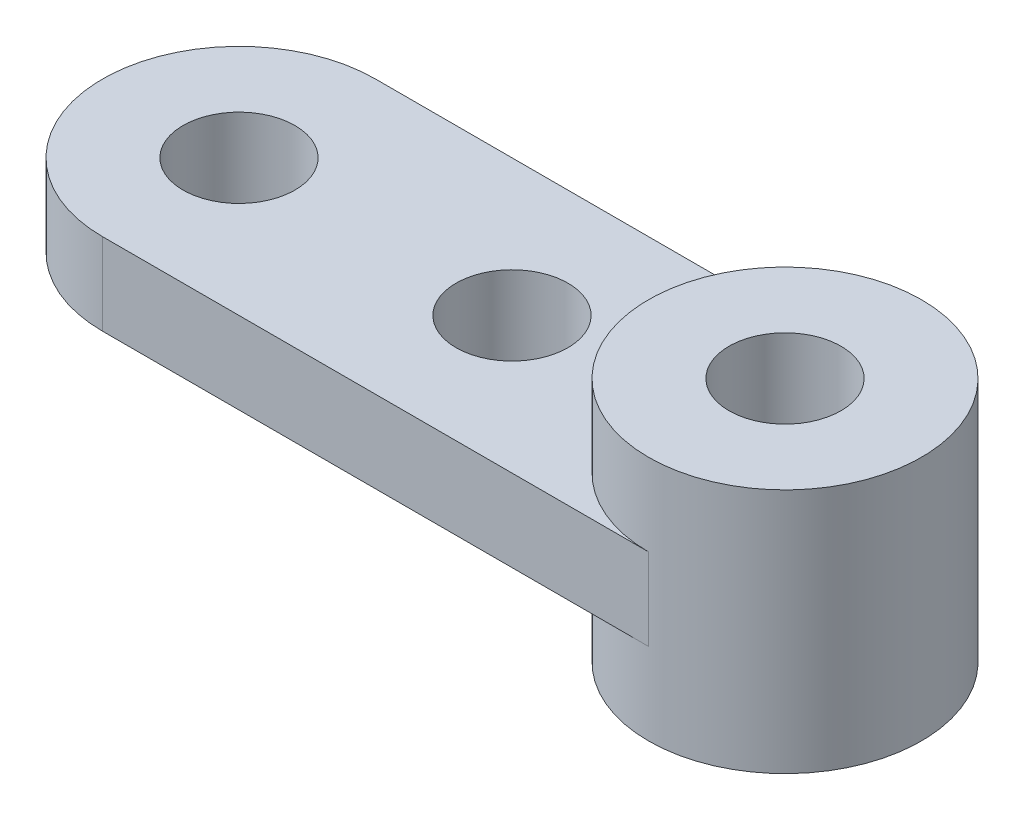
ISO-10303-21;
HEADER;
FILE_DESCRIPTION(('STEP AP214'),'2;1');
FILE_NAME('part.step','',(''),(''),'','','');
FILE_SCHEMA(('AUTOMOTIVE_DESIGN { 1 0 10303 214 1 1 1 1 }'));
ENDSEC;
DATA;
#1=APPLICATION_CONTEXT('core data for automotive mechanical design processes');
#2=APPLICATION_PROTOCOL_DEFINITION('international standard','automotive_design',2000,#1);
#3=PRODUCT_CONTEXT('',#1,'mechanical');
#4=PRODUCT('Part','Part','',(#3));
#5=PRODUCT_RELATED_PRODUCT_CATEGORY('part','',(#4));
#6=PRODUCT_DEFINITION_FORMATION('','',#4);
#7=PRODUCT_DEFINITION_CONTEXT('part definition',#1,'design');
#8=PRODUCT_DEFINITION('design','',#6,#7);
#9=PRODUCT_DEFINITION_SHAPE('','',#8);
#10=(LENGTH_UNIT() NAMED_UNIT(*) SI_UNIT(.MILLI.,.METRE.));
#11=(NAMED_UNIT(*) PLANE_ANGLE_UNIT() SI_UNIT($,.RADIAN.));
#12=(NAMED_UNIT(*) SI_UNIT($,.STERADIAN.) SOLID_ANGLE_UNIT());
#13=UNCERTAINTY_MEASURE_WITH_UNIT(LENGTH_MEASURE(1.E-05),#10,'distance_accuracy_value','');
#14=(GEOMETRIC_REPRESENTATION_CONTEXT(3) GLOBAL_UNCERTAINTY_ASSIGNED_CONTEXT((#13)) GLOBAL_UNIT_ASSIGNED_CONTEXT((#10,
#11,#12)) REPRESENTATION_CONTEXT('',''));
#15=CARTESIAN_POINT('',(0.,0.,0.));
#16=DIRECTION('',(0.,0.,1.));
#17=DIRECTION('',(1.,0.,0.));
#18=AXIS2_PLACEMENT_3D('',#15,#16,#17);
#19=CARTESIAN_POINT('',(-10.,1.5,5.));
#20=DIRECTION('',(0.,1.,0.));
#21=DIRECTION('',(0.,0.,1.));
#22=AXIS2_PLACEMENT_3D('',#19,#20,#21);
#23=PLANE('',#22);
#24=CARTESIAN_POINT('',(10.,1.5,5.));
#25=DIRECTION('',(0.,1.,0.));
#26=DIRECTION('',(0.,0.,1.));
#27=AXIS2_PLACEMENT_3D('',#24,#25,#26);
#28=CIRCLE('',#27,5.);
#29=CARTESIAN_POINT('',(10.,1.5,0.));
#30=VERTEX_POINT('',#29);
#31=CARTESIAN_POINT('',(10.,1.5,10.));
#32=VERTEX_POINT('',#31);
#33=EDGE_CURVE('E54',#30,#32,#28,.T.);
#34=ORIENTED_EDGE('',*,*,#33,.F.);
#35=DIRECTION('',(-1.,0.,0.));
#36=VECTOR('',#35,1.);
#37=CARTESIAN_POINT('',(5.,1.5,0.));
#38=LINE('',#37,#36);
#39=CARTESIAN_POINT('',(-10.,1.5,0.));
#40=VERTEX_POINT('',#39);
#41=EDGE_CURVE('E63',#30,#40,#38,.T.);
#42=ORIENTED_EDGE('',*,*,#41,.T.);
#43=CARTESIAN_POINT('',(-10.,1.5,5.));
#44=DIRECTION('',(0.,1.,0.));
#45=DIRECTION('',(0.,0.,1.));
#46=AXIS2_PLACEMENT_3D('',#43,#44,#45);
#47=CIRCLE('',#46,5.);
#48=CARTESIAN_POINT('',(-10.,1.5,10.));
#49=VERTEX_POINT('',#48);
#50=EDGE_CURVE('E105',#40,#49,#47,.T.);
#51=ORIENTED_EDGE('',*,*,#50,.T.);
#52=DIRECTION('',(1.,0.,0.));
#53=VECTOR('',#52,1.);
#54=CARTESIAN_POINT('',(-10.,1.5,10.));
#55=LINE('',#54,#53);
#56=EDGE_CURVE('E87',#49,#32,#55,.T.);
#57=ORIENTED_EDGE('',*,*,#56,.T.);
#58=EDGE_LOOP('',(#34,#42,#51,#57));
#59=FACE_BOUND('',#58,.T.);
#60=CARTESIAN_POINT('',(-10.,1.5,5.));
#61=DIRECTION('',(0.,1.,0.));
#62=DIRECTION('',(0.,0.,-1.));
#63=AXIS2_PLACEMENT_3D('',#60,#61,#62);
#64=CIRCLE('',#63,2.05);
#65=CARTESIAN_POINT('',(-10.,1.5,2.95));
#66=VERTEX_POINT('',#65);
#67=EDGE_CURVE('E120',#66,#66,#64,.T.);
#68=ORIENTED_EDGE('',*,*,#67,.F.);
#69=EDGE_LOOP('',(#68));
#70=FACE_BOUND('',#69,.T.);
#71=CARTESIAN_POINT('',(0.,1.5,5.));
#72=DIRECTION('',(0.,1.,0.));
#73=DIRECTION('',(0.,0.,1.));
#74=AXIS2_PLACEMENT_3D('',#71,#72,#73);
#75=CIRCLE('',#74,2.05);
#76=CARTESIAN_POINT('',(0.,1.5,7.05));
#77=VERTEX_POINT('',#76);
#78=EDGE_CURVE('E131',#77,#77,#75,.T.);
#79=ORIENTED_EDGE('',*,*,#78,.F.);
#80=EDGE_LOOP('',(#79));
#81=FACE_BOUND('',#80,.T.);
#82=ADVANCED_FACE('F43',(#59,#70,#81),#23,.T.);
#83=CARTESIAN_POINT('',(-10.,-1.5,5.));
#84=DIRECTION('',(0.,1.,0.));
#85=DIRECTION('',(0.,0.,1.));
#86=AXIS2_PLACEMENT_3D('',#83,#84,#85);
#87=PLANE('',#86);
#88=DIRECTION('',(-1.,0.,0.));
#89=VECTOR('',#88,1.);
#90=CARTESIAN_POINT('',(-10.,-1.5,0.));
#91=LINE('',#90,#89);
#92=CARTESIAN_POINT('',(10.,-1.5,0.));
#93=VERTEX_POINT('',#92);
#94=CARTESIAN_POINT('',(-10.,-1.5,0.));
#95=VERTEX_POINT('',#94);
#96=EDGE_CURVE('E80',#93,#95,#91,.T.);
#97=ORIENTED_EDGE('',*,*,#96,.F.);
#98=CARTESIAN_POINT('',(10.,-1.5,5.));
#99=DIRECTION('',(0.,1.,0.));
#100=DIRECTION('',(0.,0.,1.));
#101=AXIS2_PLACEMENT_3D('',#98,#99,#100);
#102=CIRCLE('',#101,5.);
#103=CARTESIAN_POINT('',(10.,-1.5,10.));
#104=VERTEX_POINT('',#103);
#105=EDGE_CURVE('E11',#93,#104,#102,.T.);
#106=ORIENTED_EDGE('',*,*,#105,.T.);
#107=DIRECTION('',(1.,0.,0.));
#108=VECTOR('',#107,1.);
#109=CARTESIAN_POINT('',(5.,-1.5,10.));
#110=LINE('',#109,#108);
#111=CARTESIAN_POINT('',(-10.,-1.5,10.));
#112=VERTEX_POINT('',#111);
#113=EDGE_CURVE('E106',#112,#104,#110,.T.);
#114=ORIENTED_EDGE('',*,*,#113,.F.);
#115=CARTESIAN_POINT('',(-10.,-1.5,5.));
#116=DIRECTION('',(0.,1.,0.));
#117=DIRECTION('',(0.,0.,1.));
#118=AXIS2_PLACEMENT_3D('',#115,#116,#117);
#119=CIRCLE('',#118,5.);
#120=EDGE_CURVE('E103',#95,#112,#119,.T.);
#121=ORIENTED_EDGE('',*,*,#120,.F.);
#122=EDGE_LOOP('',(#97,#106,#114,#121));
#123=FACE_BOUND('',#122,.T.);
#124=CARTESIAN_POINT('',(-10.,-1.5,5.));
#125=DIRECTION('',(0.,1.,0.));
#126=DIRECTION('',(0.,0.,-1.));
#127=AXIS2_PLACEMENT_3D('',#124,#125,#126);
#128=CIRCLE('',#127,2.05);
#129=CARTESIAN_POINT('',(-10.,-1.5,2.95));
#130=VERTEX_POINT('',#129);
#131=EDGE_CURVE('E127',#130,#130,#128,.T.);
#132=ORIENTED_EDGE('',*,*,#131,.T.);
#133=EDGE_LOOP('',(#132));
#134=FACE_BOUND('',#133,.T.);
#135=CARTESIAN_POINT('',(0.,-1.5,5.));
#136=DIRECTION('',(0.,1.,0.));
#137=DIRECTION('',(0.,0.,1.));
#138=AXIS2_PLACEMENT_3D('',#135,#136,#137);
#139=CIRCLE('',#138,2.05);
#140=CARTESIAN_POINT('',(0.,-1.5,7.05));
#141=VERTEX_POINT('',#140);
#142=EDGE_CURVE('E135',#141,#141,#139,.T.);
#143=ORIENTED_EDGE('',*,*,#142,.T.);
#144=EDGE_LOOP('',(#143));
#145=FACE_BOUND('',#144,.T.);
#146=ADVANCED_FACE('F100',(#123,#134,#145),#87,.F.);
#147=CARTESIAN_POINT('',(-10.,1.5,5.));
#148=DIRECTION('',(0.,-1.,0.));
#149=DIRECTION('',(0.,0.,-1.));
#150=AXIS2_PLACEMENT_3D('',#147,#148,#149);
#151=CYLINDRICAL_SURFACE('',#150,5.);
#152=ORIENTED_EDGE('',*,*,#120,.T.);
#153=DIRECTION('',(0.,-1.,0.));
#154=VECTOR('',#153,1.);
#155=CARTESIAN_POINT('',(-10.,1.5,10.));
#156=LINE('',#155,#154);
#157=EDGE_CURVE('E47',#49,#112,#156,.T.);
#158=ORIENTED_EDGE('',*,*,#157,.F.);
#159=ORIENTED_EDGE('',*,*,#50,.F.);
#160=DIRECTION('',(0.,-1.,0.));
#161=VECTOR('',#160,1.);
#162=CARTESIAN_POINT('',(-10.,1.5,0.));
#163=LINE('',#162,#161);
#164=EDGE_CURVE('E110',#40,#95,#163,.T.);
#165=ORIENTED_EDGE('',*,*,#164,.T.);
#166=EDGE_LOOP('',(#152,#158,#159,#165));
#167=FACE_BOUND('',#166,.T.);
#168=ADVANCED_FACE('F45',(#167),#151,.T.);
#169=CARTESIAN_POINT('',(5.,1.5,10.));
#170=DIRECTION('',(0.,0.,-1.));
#171=DIRECTION('',(-1.,0.,0.));
#172=AXIS2_PLACEMENT_3D('',#169,#170,#171);
#173=PLANE('',#172);
#174=ORIENTED_EDGE('',*,*,#113,.T.);
#175=DIRECTION('',(0.,-1.,0.));
#176=VECTOR('',#175,1.);
#177=CARTESIAN_POINT('',(10.,1.5,10.));
#178=LINE('',#177,#176);
#179=EDGE_CURVE('E98',#32,#104,#178,.T.);
#180=ORIENTED_EDGE('',*,*,#179,.F.);
#181=ORIENTED_EDGE('',*,*,#56,.F.);
#182=ORIENTED_EDGE('',*,*,#157,.T.);
#183=EDGE_LOOP('',(#174,#180,#181,#182));
#184=FACE_BOUND('',#183,.T.);
#185=ADVANCED_FACE('F186',(#184),#173,.F.);
#186=CARTESIAN_POINT('',(10.,1.5,5.));
#187=DIRECTION('',(0.,-1.,0.));
#188=DIRECTION('',(0.,0.,-1.));
#189=AXIS2_PLACEMENT_3D('',#186,#187,#188);
#190=CYLINDRICAL_SURFACE('',#189,5.);
#191=ORIENTED_EDGE('',*,*,#179,.T.);
#192=ORIENTED_EDGE('',*,*,#105,.F.);
#193=DIRECTION('',(0.,-1.,0.));
#194=VECTOR('',#193,1.);
#195=CARTESIAN_POINT('',(10.,1.5,0.));
#196=LINE('',#195,#194);
#197=EDGE_CURVE('E97',#30,#93,#196,.T.);
#198=ORIENTED_EDGE('',*,*,#197,.F.);
#199=ORIENTED_EDGE('',*,*,#33,.T.);
#200=EDGE_LOOP('',(#191,#192,#198,#199));
#201=FACE_BOUND('',#200,.T.);
#202=CARTESIAN_POINT('',(10.,4.5,5.));
#203=DIRECTION('',(0.,1.,0.));
#204=DIRECTION('',(0.,0.,1.));
#205=AXIS2_PLACEMENT_3D('',#202,#203,#204);
#206=CIRCLE('',#205,5.);
#207=CARTESIAN_POINT('',(10.,4.5,10.));
#208=VERTEX_POINT('',#207);
#209=EDGE_CURVE('E139',#208,#208,#206,.T.);
#210=ORIENTED_EDGE('',*,*,#209,.F.);
#211=EDGE_LOOP('',(#210));
#212=FACE_BOUND('',#211,.T.);
#213=CARTESIAN_POINT('',(10.,-4.5,5.));
#214=DIRECTION('',(0.,1.,0.));
#215=DIRECTION('',(0.,0.,1.));
#216=AXIS2_PLACEMENT_3D('',#213,#214,#215);
#217=CIRCLE('',#216,5.);
#218=CARTESIAN_POINT('',(10.,-4.5,10.));
#219=VERTEX_POINT('',#218);
#220=EDGE_CURVE('E151',#219,#219,#217,.T.);
#221=ORIENTED_EDGE('',*,*,#220,.T.);
#222=EDGE_LOOP('',(#221));
#223=FACE_BOUND('',#222,.T.);
#224=ADVANCED_FACE('F94',(#201,#212,#223),#190,.T.);
#225=CARTESIAN_POINT('',(-10.,1.5,0.));
#226=DIRECTION('',(0.,0.,1.));
#227=DIRECTION('',(1.,0.,0.));
#228=AXIS2_PLACEMENT_3D('',#225,#226,#227);
#229=PLANE('',#228);
#230=ORIENTED_EDGE('',*,*,#96,.T.);
#231=ORIENTED_EDGE('',*,*,#164,.F.);
#232=ORIENTED_EDGE('',*,*,#41,.F.);
#233=ORIENTED_EDGE('',*,*,#197,.T.);
#234=EDGE_LOOP('',(#230,#231,#232,#233));
#235=FACE_BOUND('',#234,.T.);
#236=ADVANCED_FACE('F108',(#235),#229,.F.);
#237=CARTESIAN_POINT('',(10.,1.5,5.));
#238=DIRECTION('',(0.,-1.,0.));
#239=DIRECTION('',(0.,0.,-1.));
#240=AXIS2_PLACEMENT_3D('',#237,#238,#239);
#241=CYLINDRICAL_SURFACE('',#240,2.05);
#242=CARTESIAN_POINT('',(10.,4.5,5.));
#243=DIRECTION('',(0.,1.,0.));
#244=DIRECTION('',(0.,0.,1.));
#245=AXIS2_PLACEMENT_3D('',#242,#243,#244);
#246=CIRCLE('',#245,2.05);
#247=CARTESIAN_POINT('',(10.,4.5,7.05));
#248=VERTEX_POINT('',#247);
#249=EDGE_CURVE('E148',#248,#248,#246,.T.);
#250=ORIENTED_EDGE('',*,*,#249,.T.);
#251=EDGE_LOOP('',(#250));
#252=FACE_BOUND('',#251,.T.);
#253=CARTESIAN_POINT('',(10.,-4.5,5.));
#254=DIRECTION('',(0.,1.,0.));
#255=DIRECTION('',(0.,0.,1.));
#256=AXIS2_PLACEMENT_3D('',#253,#254,#255);
#257=CIRCLE('',#256,2.05);
#258=CARTESIAN_POINT('',(10.,-4.5,7.05));
#259=VERTEX_POINT('',#258);
#260=EDGE_CURVE('E156',#259,#259,#257,.T.);
#261=ORIENTED_EDGE('',*,*,#260,.F.);
#262=EDGE_LOOP('',(#261));
#263=FACE_BOUND('',#262,.T.);
#264=ADVANCED_FACE('F164',(#252,#263),#241,.F.);
#265=CARTESIAN_POINT('',(-10.,1.5,5.));
#266=DIRECTION('',(0.,-1.,0.));
#267=DIRECTION('',(0.,0.,-1.));
#268=AXIS2_PLACEMENT_3D('',#265,#266,#267);
#269=CYLINDRICAL_SURFACE('',#268,2.05);
#270=ORIENTED_EDGE('',*,*,#67,.T.);
#271=EDGE_LOOP('',(#270));
#272=FACE_BOUND('',#271,.T.);
#273=ORIENTED_EDGE('',*,*,#131,.F.);
#274=EDGE_LOOP('',(#273));
#275=FACE_BOUND('',#274,.T.);
#276=ADVANCED_FACE('F166',(#272,#275),#269,.F.);
#277=CARTESIAN_POINT('',(0.,1.5,5.));
#278=DIRECTION('',(0.,-1.,0.));
#279=DIRECTION('',(0.,0.,-1.));
#280=AXIS2_PLACEMENT_3D('',#277,#278,#279);
#281=CYLINDRICAL_SURFACE('',#280,2.05);
#282=ORIENTED_EDGE('',*,*,#78,.T.);
#283=EDGE_LOOP('',(#282));
#284=FACE_BOUND('',#283,.T.);
#285=ORIENTED_EDGE('',*,*,#142,.F.);
#286=EDGE_LOOP('',(#285));
#287=FACE_BOUND('',#286,.T.);
#288=ADVANCED_FACE('F173',(#284,#287),#281,.F.);
#289=CARTESIAN_POINT('',(10.,4.5,5.));
#290=DIRECTION('',(0.,1.,0.));
#291=DIRECTION('',(0.,0.,1.));
#292=AXIS2_PLACEMENT_3D('',#289,#290,#291);
#293=PLANE('',#292);
#294=ORIENTED_EDGE('',*,*,#209,.T.);
#295=EDGE_LOOP('',(#294));
#296=FACE_BOUND('',#295,.T.);
#297=ORIENTED_EDGE('',*,*,#249,.F.);
#298=EDGE_LOOP('',(#297));
#299=FACE_BOUND('',#298,.T.);
#300=ADVANCED_FACE('F209',(#296,#299),#293,.T.);
#301=CARTESIAN_POINT('',(10.,-4.5,5.));
#302=DIRECTION('',(0.,-1.,0.));
#303=DIRECTION('',(0.,0.,1.));
#304=AXIS2_PLACEMENT_3D('',#301,#302,#303);
#305=PLANE('',#304);
#306=ORIENTED_EDGE('',*,*,#260,.T.);
#307=EDGE_LOOP('',(#306));
#308=FACE_BOUND('',#307,.T.);
#309=ORIENTED_EDGE('',*,*,#220,.F.);
#310=EDGE_LOOP('',(#309));
#311=FACE_BOUND('',#310,.T.);
#312=ADVANCED_FACE('F161',(#308,#311),#305,.T.);
#313=CLOSED_SHELL('',(#82,#146,#168,#185,#224,#236,#264,#276,#288,#300,#312));
#314=MANIFOLD_SOLID_BREP('B2',#313);
#315=ADVANCED_BREP_SHAPE_REPRESENTATION('',(#18,#314),#14);
#316=SHAPE_DEFINITION_REPRESENTATION(#9,#315);
ENDSEC;
END-ISO-10303-21;
